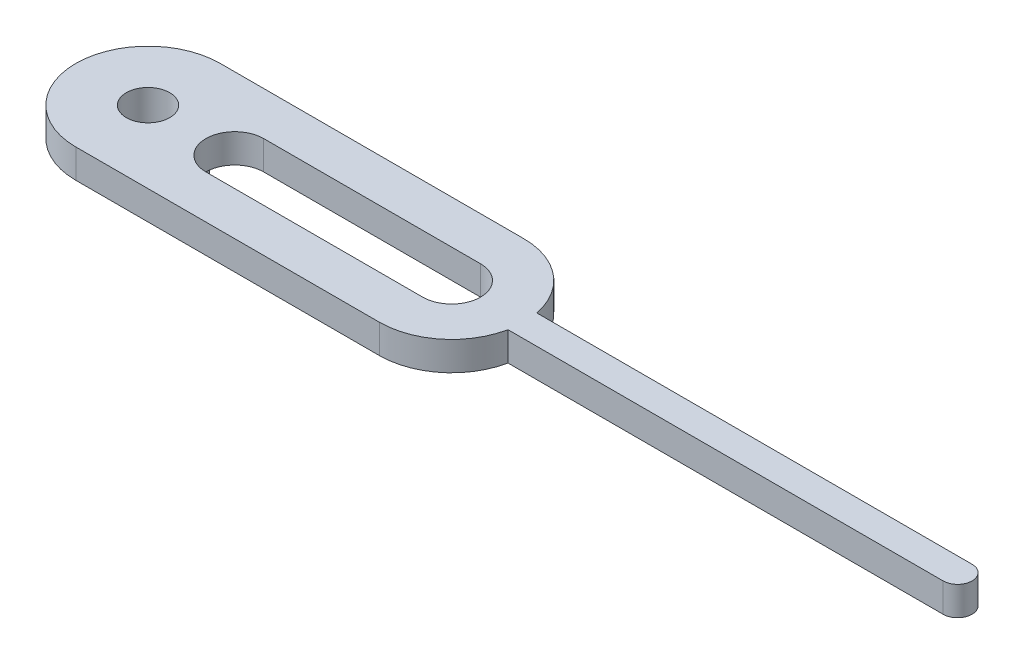
ISO-10303-21;
HEADER;
FILE_DESCRIPTION(('STEP AP214'),'2;1');
FILE_NAME('part.step','',(''),(''),'','','');
FILE_SCHEMA(('AUTOMOTIVE_DESIGN { 1 0 10303 214 1 1 1 1 }'));
ENDSEC;
DATA;
#1=APPLICATION_CONTEXT('core data for automotive mechanical design processes');
#2=APPLICATION_PROTOCOL_DEFINITION('international standard','automotive_design',2000,#1);
#3=PRODUCT_CONTEXT('',#1,'mechanical');
#4=PRODUCT('Part','Part','',(#3));
#5=PRODUCT_RELATED_PRODUCT_CATEGORY('part','',(#4));
#6=PRODUCT_DEFINITION_FORMATION('','',#4);
#7=PRODUCT_DEFINITION_CONTEXT('part definition',#1,'design');
#8=PRODUCT_DEFINITION('design','',#6,#7);
#9=PRODUCT_DEFINITION_SHAPE('','',#8);
#10=(LENGTH_UNIT() NAMED_UNIT(*) SI_UNIT(.MILLI.,.METRE.));
#11=(NAMED_UNIT(*) PLANE_ANGLE_UNIT() SI_UNIT($,.RADIAN.));
#12=(NAMED_UNIT(*) SI_UNIT($,.STERADIAN.) SOLID_ANGLE_UNIT());
#13=UNCERTAINTY_MEASURE_WITH_UNIT(LENGTH_MEASURE(1.E-05),#10,'distance_accuracy_value','');
#14=(GEOMETRIC_REPRESENTATION_CONTEXT(3) GLOBAL_UNCERTAINTY_ASSIGNED_CONTEXT((#13)) GLOBAL_UNIT_ASSIGNED_CONTEXT((#10,
#11,#12)) REPRESENTATION_CONTEXT('',''));
#15=CARTESIAN_POINT('',(0.,0.,0.));
#16=DIRECTION('',(0.,0.,1.));
#17=DIRECTION('',(1.,0.,0.));
#18=AXIS2_PLACEMENT_3D('',#15,#16,#17);
#19=CARTESIAN_POINT('',(0.,0.,0.));
#20=DIRECTION('',(0.,1.,0.));
#21=DIRECTION('',(0.,0.,1.));
#22=AXIS2_PLACEMENT_3D('',#19,#20,#21);
#23=PLANE('',#22);
#24=DIRECTION('',(1.,0.,0.));
#25=VECTOR('',#24,1.);
#26=CARTESIAN_POINT('',(0.,0.,-5.));
#27=LINE('',#26,#25);
#28=CARTESIAN_POINT('',(14.4948974278318,0.,-5.));
#29=VERTEX_POINT('',#28);
#30=CARTESIAN_POINT('',(165.,0.,-5.00000000000004));
#31=VERTEX_POINT('',#30);
#32=EDGE_CURVE('E193',#29,#31,#27,.T.);
#33=ORIENTED_EDGE('',*,*,#32,.T.);
#34=CARTESIAN_POINT('',(165.,0.,0.));
#35=DIRECTION('',(0.,1.,0.));
#36=DIRECTION('',(0.,0.,1.));
#37=AXIS2_PLACEMENT_3D('',#34,#35,#36);
#38=CIRCLE('',#37,5.);
#39=CARTESIAN_POINT('',(165.,0.,4.99999999999997));
#40=VERTEX_POINT('',#39);
#41=EDGE_CURVE('E217',#31,#40,#38,.F.);
#42=ORIENTED_EDGE('',*,*,#41,.T.);
#43=DIRECTION('',(-1.,0.,0.));
#44=VECTOR('',#43,1.);
#45=CARTESIAN_POINT('',(0.,0.,4.99999999999999));
#46=LINE('',#45,#44);
#47=CARTESIAN_POINT('',(14.4948974278318,0.,4.99999999999999));
#48=VERTEX_POINT('',#47);
#49=EDGE_CURVE('E214',#40,#48,#46,.T.);
#50=ORIENTED_EDGE('',*,*,#49,.T.);
#51=CARTESIAN_POINT('',(-10.,0.,0.));
#52=DIRECTION('',(0.,1.,0.));
#53=DIRECTION('',(0.,0.,1.));
#54=AXIS2_PLACEMENT_3D('',#51,#52,#53);
#55=CIRCLE('',#54,25.);
#56=CARTESIAN_POINT('',(-10.,0.,25.));
#57=VERTEX_POINT('',#56);
#58=EDGE_CURVE('E161',#57,#48,#55,.T.);
#59=ORIENTED_EDGE('',*,*,#58,.F.);
#60=DIRECTION('',(1.,0.,0.));
#61=VECTOR('',#60,1.);
#62=CARTESIAN_POINT('',(0.,0.,25.));
#63=LINE('',#62,#61);
#64=CARTESIAN_POINT('',(-115.,0.,25.));
#65=VERTEX_POINT('',#64);
#66=EDGE_CURVE('E208',#65,#57,#63,.T.);
#67=ORIENTED_EDGE('',*,*,#66,.F.);
#68=CARTESIAN_POINT('',(-115.,0.,0.));
#69=DIRECTION('',(0.,1.,0.));
#70=DIRECTION('',(0.,0.,1.));
#71=AXIS2_PLACEMENT_3D('',#68,#69,#70);
#72=CIRCLE('',#71,25.);
#73=CARTESIAN_POINT('',(-115.,0.,-25.));
#74=VERTEX_POINT('',#73);
#75=EDGE_CURVE('E204',#74,#65,#72,.T.);
#76=ORIENTED_EDGE('',*,*,#75,.F.);
#77=DIRECTION('',(-1.,0.,0.));
#78=VECTOR('',#77,1.);
#79=CARTESIAN_POINT('',(0.,0.,-25.));
#80=LINE('',#79,#78);
#81=CARTESIAN_POINT('',(-10.,0.,-25.));
#82=VERTEX_POINT('',#81);
#83=EDGE_CURVE('E200',#82,#74,#80,.T.);
#84=ORIENTED_EDGE('',*,*,#83,.F.);
#85=CARTESIAN_POINT('',(-10.,0.,0.));
#86=DIRECTION('',(0.,1.,0.));
#87=DIRECTION('',(0.,0.,1.));
#88=AXIS2_PLACEMENT_3D('',#85,#86,#87);
#89=CIRCLE('',#88,25.);
#90=EDGE_CURVE('E196',#29,#82,#89,.T.);
#91=ORIENTED_EDGE('',*,*,#90,.F.);
#92=EDGE_LOOP('',(#33,#42,#50,#59,#67,#76,#84,#91));
#93=FACE_BOUND('',#92,.T.);
#94=CARTESIAN_POINT('',(-85.,0.,0.));
#95=DIRECTION('',(0.,1.,0.));
#96=DIRECTION('',(0.,0.,1.));
#97=AXIS2_PLACEMENT_3D('',#94,#95,#96);
#98=CIRCLE('',#97,10.);
#99=CARTESIAN_POINT('',(-85.,0.,-10.));
#100=VERTEX_POINT('',#99);
#101=CARTESIAN_POINT('',(-85.,0.,10.));
#102=VERTEX_POINT('',#101);
#103=EDGE_CURVE('E176',#100,#102,#98,.T.);
#104=ORIENTED_EDGE('',*,*,#103,.T.);
#105=DIRECTION('',(1.,0.,0.));
#106=VECTOR('',#105,1.);
#107=CARTESIAN_POINT('',(0.,0.,10.));
#108=LINE('',#107,#106);
#109=CARTESIAN_POINT('',(-10.,0.,10.));
#110=VERTEX_POINT('',#109);
#111=EDGE_CURVE('E189',#102,#110,#108,.T.);
#112=ORIENTED_EDGE('',*,*,#111,.T.);
#113=CARTESIAN_POINT('',(-10.,0.,0.));
#114=DIRECTION('',(0.,1.,0.));
#115=DIRECTION('',(0.,0.,1.));
#116=AXIS2_PLACEMENT_3D('',#113,#114,#115);
#117=CIRCLE('',#116,10.);
#118=CARTESIAN_POINT('',(-10.,0.,-10.));
#119=VERTEX_POINT('',#118);
#120=EDGE_CURVE('E185',#119,#110,#117,.F.);
#121=ORIENTED_EDGE('',*,*,#120,.F.);
#122=DIRECTION('',(-1.,0.,0.));
#123=VECTOR('',#122,1.);
#124=CARTESIAN_POINT('',(0.,0.,-10.));
#125=LINE('',#124,#123);
#126=EDGE_CURVE('E180',#119,#100,#125,.T.);
#127=ORIENTED_EDGE('',*,*,#126,.T.);
#128=EDGE_LOOP('',(#104,#112,#121,#127));
#129=FACE_BOUND('',#128,.T.);
#130=CARTESIAN_POINT('',(-115.,0.,0.));
#131=DIRECTION('',(0.,1.,0.));
#132=DIRECTION('',(0.,0.,1.));
#133=AXIS2_PLACEMENT_3D('',#130,#131,#132);
#134=CIRCLE('',#133,15.);
#135=CARTESIAN_POINT('',(-115.,0.,15.));
#136=VERTEX_POINT('',#135);
#137=EDGE_CURVE('E11',#136,#136,#134,.F.);
#138=ORIENTED_EDGE('',*,*,#137,.F.);
#139=EDGE_LOOP('',(#138));
#140=FACE_BOUND('',#139,.T.);
#141=ADVANCED_FACE('F47',(#93,#129,#140),#23,.F.);
#142=CARTESIAN_POINT('',(0.,10.,-5.));
#143=DIRECTION('',(0.,0.,-1.));
#144=DIRECTION('',(-1.,0.,0.));
#145=AXIS2_PLACEMENT_3D('',#142,#143,#144);
#146=PLANE('',#145);
#147=ORIENTED_EDGE('',*,*,#32,.F.);
#148=DIRECTION('',(0.,-1.,0.));
#149=VECTOR('',#148,1.);
#150=CARTESIAN_POINT('',(14.4948974278318,10.,-5.));
#151=LINE('',#150,#149);
#152=CARTESIAN_POINT('',(14.4948974278318,10.,-5.));
#153=VERTEX_POINT('',#152);
#154=EDGE_CURVE('E57',#153,#29,#151,.T.);
#155=ORIENTED_EDGE('',*,*,#154,.F.);
#156=DIRECTION('',(1.,0.,0.));
#157=VECTOR('',#156,1.);
#158=CARTESIAN_POINT('',(0.,10.,-5.));
#159=LINE('',#158,#157);
#160=CARTESIAN_POINT('',(165.,10.,-5.00000000000004));
#161=VERTEX_POINT('',#160);
#162=EDGE_CURVE('E281',#153,#161,#159,.T.);
#163=ORIENTED_EDGE('',*,*,#162,.T.);
#164=DIRECTION('',(0.,-1.,0.));
#165=VECTOR('',#164,1.);
#166=CARTESIAN_POINT('',(165.,10.,-5.00000000000004));
#167=LINE('',#166,#165);
#168=EDGE_CURVE('E65',#161,#31,#167,.T.);
#169=ORIENTED_EDGE('',*,*,#168,.T.);
#170=EDGE_LOOP('',(#147,#155,#163,#169));
#171=FACE_BOUND('',#170,.T.);
#172=ADVANCED_FACE('F318',(#171),#146,.T.);
#173=CARTESIAN_POINT('',(-10.,10.,0.));
#174=DIRECTION('',(0.,-1.,0.));
#175=DIRECTION('',(0.,0.,-1.));
#176=AXIS2_PLACEMENT_3D('',#173,#174,#175);
#177=CYLINDRICAL_SURFACE('',#176,25.);
#178=ORIENTED_EDGE('',*,*,#90,.T.);
#179=DIRECTION('',(0.,-1.,0.));
#180=VECTOR('',#179,1.);
#181=CARTESIAN_POINT('',(-10.,10.,-25.));
#182=LINE('',#181,#180);
#183=CARTESIAN_POINT('',(-10.,10.,-25.));
#184=VERTEX_POINT('',#183);
#185=EDGE_CURVE('E236',#184,#82,#182,.T.);
#186=ORIENTED_EDGE('',*,*,#185,.F.);
#187=CARTESIAN_POINT('',(-10.,10.,0.));
#188=DIRECTION('',(0.,1.,0.));
#189=DIRECTION('',(0.,0.,1.));
#190=AXIS2_PLACEMENT_3D('',#187,#188,#189);
#191=CIRCLE('',#190,25.);
#192=EDGE_CURVE('E284',#153,#184,#191,.T.);
#193=ORIENTED_EDGE('',*,*,#192,.F.);
#194=ORIENTED_EDGE('',*,*,#154,.T.);
#195=EDGE_LOOP('',(#178,#186,#193,#194));
#196=FACE_BOUND('',#195,.T.);
#197=ADVANCED_FACE('F322',(#196),#177,.T.);
#198=CARTESIAN_POINT('',(0.,10.,-25.));
#199=DIRECTION('',(0.,0.,1.));
#200=DIRECTION('',(1.,0.,0.));
#201=AXIS2_PLACEMENT_3D('',#198,#199,#200);
#202=PLANE('',#201);
#203=ORIENTED_EDGE('',*,*,#83,.T.);
#204=DIRECTION('',(0.,-1.,0.));
#205=VECTOR('',#204,1.);
#206=CARTESIAN_POINT('',(-115.,10.,-25.));
#207=LINE('',#206,#205);
#208=CARTESIAN_POINT('',(-115.,10.,-25.));
#209=VERTEX_POINT('',#208);
#210=EDGE_CURVE('E232',#209,#74,#207,.T.);
#211=ORIENTED_EDGE('',*,*,#210,.F.);
#212=DIRECTION('',(-1.,0.,0.));
#213=VECTOR('',#212,1.);
#214=CARTESIAN_POINT('',(0.,10.,-25.));
#215=LINE('',#214,#213);
#216=EDGE_CURVE('E288',#184,#209,#215,.T.);
#217=ORIENTED_EDGE('',*,*,#216,.F.);
#218=ORIENTED_EDGE('',*,*,#185,.T.);
#219=EDGE_LOOP('',(#203,#211,#217,#218));
#220=FACE_BOUND('',#219,.T.);
#221=ADVANCED_FACE('F458',(#220),#202,.F.);
#222=CARTESIAN_POINT('',(-115.,10.,0.));
#223=DIRECTION('',(0.,-1.,0.));
#224=DIRECTION('',(0.,0.,-1.));
#225=AXIS2_PLACEMENT_3D('',#222,#223,#224);
#226=CYLINDRICAL_SURFACE('',#225,25.);
#227=ORIENTED_EDGE('',*,*,#75,.T.);
#228=DIRECTION('',(0.,-1.,0.));
#229=VECTOR('',#228,1.);
#230=CARTESIAN_POINT('',(-115.,10.,25.));
#231=LINE('',#230,#229);
#232=CARTESIAN_POINT('',(-115.,10.,25.));
#233=VERTEX_POINT('',#232);
#234=EDGE_CURVE('E228',#233,#65,#231,.T.);
#235=ORIENTED_EDGE('',*,*,#234,.F.);
#236=CARTESIAN_POINT('',(-115.,10.,0.));
#237=DIRECTION('',(0.,1.,0.));
#238=DIRECTION('',(0.,0.,1.));
#239=AXIS2_PLACEMENT_3D('',#236,#237,#238);
#240=CIRCLE('',#239,25.);
#241=EDGE_CURVE('E292',#209,#233,#240,.T.);
#242=ORIENTED_EDGE('',*,*,#241,.F.);
#243=ORIENTED_EDGE('',*,*,#210,.T.);
#244=EDGE_LOOP('',(#227,#235,#242,#243));
#245=FACE_BOUND('',#244,.T.);
#246=ADVANCED_FACE('F298',(#245),#226,.T.);
#247=CARTESIAN_POINT('',(0.,10.,25.));
#248=DIRECTION('',(0.,0.,-1.));
#249=DIRECTION('',(-1.,0.,0.));
#250=AXIS2_PLACEMENT_3D('',#247,#248,#249);
#251=PLANE('',#250);
#252=ORIENTED_EDGE('',*,*,#66,.T.);
#253=DIRECTION('',(0.,-1.,0.));
#254=VECTOR('',#253,1.);
#255=CARTESIAN_POINT('',(-10.,10.,25.));
#256=LINE('',#255,#254);
#257=CARTESIAN_POINT('',(-10.,10.,25.));
#258=VERTEX_POINT('',#257);
#259=EDGE_CURVE('E165',#258,#57,#256,.T.);
#260=ORIENTED_EDGE('',*,*,#259,.F.);
#261=DIRECTION('',(1.,0.,0.));
#262=VECTOR('',#261,1.);
#263=CARTESIAN_POINT('',(0.,10.,25.));
#264=LINE('',#263,#262);
#265=EDGE_CURVE('E152',#233,#258,#264,.T.);
#266=ORIENTED_EDGE('',*,*,#265,.F.);
#267=ORIENTED_EDGE('',*,*,#234,.T.);
#268=EDGE_LOOP('',(#252,#260,#266,#267));
#269=FACE_BOUND('',#268,.T.);
#270=ADVANCED_FACE('F300',(#269),#251,.F.);
#271=CARTESIAN_POINT('',(-10.,10.,0.));
#272=DIRECTION('',(0.,-1.,0.));
#273=DIRECTION('',(0.,0.,-1.));
#274=AXIS2_PLACEMENT_3D('',#271,#272,#273);
#275=CYLINDRICAL_SURFACE('',#274,25.);
#276=ORIENTED_EDGE('',*,*,#58,.T.);
#277=DIRECTION('',(0.,-1.,0.));
#278=VECTOR('',#277,1.);
#279=CARTESIAN_POINT('',(14.4948974278318,10.,4.99999999999999));
#280=LINE('',#279,#278);
#281=CARTESIAN_POINT('',(14.4948974278318,10.,4.99999999999999));
#282=VERTEX_POINT('',#281);
#283=EDGE_CURVE('E159',#282,#48,#280,.T.);
#284=ORIENTED_EDGE('',*,*,#283,.F.);
#285=CARTESIAN_POINT('',(-10.,10.,0.));
#286=DIRECTION('',(0.,1.,0.));
#287=DIRECTION('',(0.,0.,1.));
#288=AXIS2_PLACEMENT_3D('',#285,#286,#287);
#289=CIRCLE('',#288,25.);
#290=EDGE_CURVE('E144',#258,#282,#289,.T.);
#291=ORIENTED_EDGE('',*,*,#290,.F.);
#292=ORIENTED_EDGE('',*,*,#259,.T.);
#293=EDGE_LOOP('',(#276,#284,#291,#292));
#294=FACE_BOUND('',#293,.T.);
#295=ADVANCED_FACE('F160',(#294),#275,.T.);
#296=CARTESIAN_POINT('',(0.,10.,4.99999999999999));
#297=DIRECTION('',(0.,0.,1.));
#298=DIRECTION('',(1.,0.,0.));
#299=AXIS2_PLACEMENT_3D('',#296,#297,#298);
#300=PLANE('',#299);
#301=ORIENTED_EDGE('',*,*,#49,.F.);
#302=DIRECTION('',(0.,-1.,0.));
#303=VECTOR('',#302,1.);
#304=CARTESIAN_POINT('',(165.,10.,4.99999999999997));
#305=LINE('',#304,#303);
#306=CARTESIAN_POINT('',(165.,10.,4.99999999999997));
#307=VERTEX_POINT('',#306);
#308=EDGE_CURVE('E103',#307,#40,#305,.T.);
#309=ORIENTED_EDGE('',*,*,#308,.F.);
#310=DIRECTION('',(-1.,0.,0.));
#311=VECTOR('',#310,1.);
#312=CARTESIAN_POINT('',(0.,10.,4.99999999999999));
#313=LINE('',#312,#311);
#314=EDGE_CURVE('E150',#307,#282,#313,.T.);
#315=ORIENTED_EDGE('',*,*,#314,.T.);
#316=ORIENTED_EDGE('',*,*,#283,.T.);
#317=EDGE_LOOP('',(#301,#309,#315,#316));
#318=FACE_BOUND('',#317,.T.);
#319=ADVANCED_FACE('F167',(#318),#300,.T.);
#320=CARTESIAN_POINT('',(-85.,10.,0.));
#321=DIRECTION('',(0.,-1.,0.));
#322=DIRECTION('',(0.,0.,-1.));
#323=AXIS2_PLACEMENT_3D('',#320,#321,#322);
#324=CYLINDRICAL_SURFACE('',#323,10.);
#325=ORIENTED_EDGE('',*,*,#103,.F.);
#326=DIRECTION('',(0.,-1.,0.));
#327=VECTOR('',#326,1.);
#328=CARTESIAN_POINT('',(-85.,10.,-10.));
#329=LINE('',#328,#327);
#330=CARTESIAN_POINT('',(-85.,10.,-10.));
#331=VERTEX_POINT('',#330);
#332=EDGE_CURVE('E115',#331,#100,#329,.T.);
#333=ORIENTED_EDGE('',*,*,#332,.F.);
#334=CARTESIAN_POINT('',(-85.,10.,0.));
#335=DIRECTION('',(0.,1.,0.));
#336=DIRECTION('',(0.,0.,1.));
#337=AXIS2_PLACEMENT_3D('',#334,#335,#336);
#338=CIRCLE('',#337,10.);
#339=CARTESIAN_POINT('',(-85.,10.,10.));
#340=VERTEX_POINT('',#339);
#341=EDGE_CURVE('E272',#331,#340,#338,.T.);
#342=ORIENTED_EDGE('',*,*,#341,.T.);
#343=DIRECTION('',(0.,-1.,0.));
#344=VECTOR('',#343,1.);
#345=CARTESIAN_POINT('',(-85.,10.,10.));
#346=LINE('',#345,#344);
#347=EDGE_CURVE('E172',#340,#102,#346,.T.);
#348=ORIENTED_EDGE('',*,*,#347,.T.);
#349=EDGE_LOOP('',(#325,#333,#342,#348));
#350=FACE_BOUND('',#349,.T.);
#351=ADVANCED_FACE('F256',(#350),#324,.F.);
#352=CARTESIAN_POINT('',(0.,10.,-10.));
#353=DIRECTION('',(0.,0.,1.));
#354=DIRECTION('',(1.,0.,0.));
#355=AXIS2_PLACEMENT_3D('',#352,#353,#354);
#356=PLANE('',#355);
#357=ORIENTED_EDGE('',*,*,#126,.F.);
#358=DIRECTION('',(0.,-1.,0.));
#359=VECTOR('',#358,1.);
#360=CARTESIAN_POINT('',(-10.,10.,-10.));
#361=LINE('',#360,#359);
#362=CARTESIAN_POINT('',(-10.,10.,-10.));
#363=VERTEX_POINT('',#362);
#364=EDGE_CURVE('E247',#363,#119,#361,.T.);
#365=ORIENTED_EDGE('',*,*,#364,.F.);
#366=DIRECTION('',(-1.,0.,0.));
#367=VECTOR('',#366,1.);
#368=CARTESIAN_POINT('',(0.,10.,-10.));
#369=LINE('',#368,#367);
#370=EDGE_CURVE('E255',#363,#331,#369,.T.);
#371=ORIENTED_EDGE('',*,*,#370,.T.);
#372=ORIENTED_EDGE('',*,*,#332,.T.);
#373=EDGE_LOOP('',(#357,#365,#371,#372));
#374=FACE_BOUND('',#373,.T.);
#375=ADVANCED_FACE('F253',(#374),#356,.T.);
#376=CARTESIAN_POINT('',(-10.,10.,0.));
#377=DIRECTION('',(0.,-1.,0.));
#378=DIRECTION('',(0.,0.,-1.));
#379=AXIS2_PLACEMENT_3D('',#376,#377,#378);
#380=CYLINDRICAL_SURFACE('',#379,10.);
#381=ORIENTED_EDGE('',*,*,#120,.T.);
#382=DIRECTION('',(0.,-1.,0.));
#383=VECTOR('',#382,1.);
#384=CARTESIAN_POINT('',(-10.,10.,10.));
#385=LINE('',#384,#383);
#386=CARTESIAN_POINT('',(-10.,10.,10.));
#387=VERTEX_POINT('',#386);
#388=EDGE_CURVE('E244',#387,#110,#385,.T.);
#389=ORIENTED_EDGE('',*,*,#388,.F.);
#390=CARTESIAN_POINT('',(-10.,10.,0.));
#391=DIRECTION('',(0.,1.,0.));
#392=DIRECTION('',(0.,0.,1.));
#393=AXIS2_PLACEMENT_3D('',#390,#391,#392);
#394=CIRCLE('',#393,10.);
#395=EDGE_CURVE('E266',#363,#387,#394,.F.);
#396=ORIENTED_EDGE('',*,*,#395,.F.);
#397=ORIENTED_EDGE('',*,*,#364,.T.);
#398=EDGE_LOOP('',(#381,#389,#396,#397));
#399=FACE_BOUND('',#398,.T.);
#400=ADVANCED_FACE('F263',(#399),#380,.F.);
#401=CARTESIAN_POINT('',(0.,10.,10.));
#402=DIRECTION('',(0.,0.,-1.));
#403=DIRECTION('',(-1.,0.,0.));
#404=AXIS2_PLACEMENT_3D('',#401,#402,#403);
#405=PLANE('',#404);
#406=ORIENTED_EDGE('',*,*,#111,.F.);
#407=ORIENTED_EDGE('',*,*,#347,.F.);
#408=DIRECTION('',(1.,0.,0.));
#409=VECTOR('',#408,1.);
#410=CARTESIAN_POINT('',(0.,10.,10.));
#411=LINE('',#410,#409);
#412=EDGE_CURVE('E270',#340,#387,#411,.T.);
#413=ORIENTED_EDGE('',*,*,#412,.T.);
#414=ORIENTED_EDGE('',*,*,#388,.T.);
#415=EDGE_LOOP('',(#406,#407,#413,#414));
#416=FACE_BOUND('',#415,.T.);
#417=ADVANCED_FACE('F313',(#416),#405,.T.);
#418=CARTESIAN_POINT('',(-115.,10.,0.));
#419=DIRECTION('',(0.,-1.,0.));
#420=DIRECTION('',(0.,0.,-1.));
#421=AXIS2_PLACEMENT_3D('',#418,#419,#420);
#422=CYLINDRICAL_SURFACE('',#421,7.5);
#423=CARTESIAN_POINT('',(-115.,10.,0.));
#424=DIRECTION('',(0.,1.,0.));
#425=DIRECTION('',(0.,0.,1.));
#426=AXIS2_PLACEMENT_3D('',#423,#424,#425);
#427=CIRCLE('',#426,7.5);
#428=CARTESIAN_POINT('',(-115.,10.,7.5));
#429=VERTEX_POINT('',#428);
#430=EDGE_CURVE('E221',#429,#429,#427,.T.);
#431=ORIENTED_EDGE('',*,*,#430,.T.);
#432=EDGE_LOOP('',(#431));
#433=FACE_BOUND('',#432,.T.);
#434=CARTESIAN_POINT('',(-115.,-10.,0.));
#435=DIRECTION('',(0.,-1.,0.));
#436=DIRECTION('',(0.,0.,-1.));
#437=AXIS2_PLACEMENT_3D('',#434,#435,#436);
#438=CIRCLE('',#437,7.5);
#439=CARTESIAN_POINT('',(-115.,-10.,-7.5));
#440=VERTEX_POINT('',#439);
#441=EDGE_CURVE('E338',#440,#440,#438,.T.);
#442=ORIENTED_EDGE('',*,*,#441,.T.);
#443=EDGE_LOOP('',(#442));
#444=FACE_BOUND('',#443,.T.);
#445=ADVANCED_FACE('F49',(#433,#444),#422,.F.);
#446=CARTESIAN_POINT('',(165.,10.,0.));
#447=DIRECTION('',(0.,-1.,0.));
#448=DIRECTION('',(0.,0.,-1.));
#449=AXIS2_PLACEMENT_3D('',#446,#447,#448);
#450=CYLINDRICAL_SURFACE('',#449,5.);
#451=ORIENTED_EDGE('',*,*,#41,.F.);
#452=ORIENTED_EDGE('',*,*,#168,.F.);
#453=CARTESIAN_POINT('',(165.,10.,0.));
#454=DIRECTION('',(0.,1.,0.));
#455=DIRECTION('',(0.,0.,1.));
#456=AXIS2_PLACEMENT_3D('',#453,#454,#455);
#457=CIRCLE('',#456,5.);
#458=EDGE_CURVE('E169',#161,#307,#457,.F.);
#459=ORIENTED_EDGE('',*,*,#458,.T.);
#460=ORIENTED_EDGE('',*,*,#308,.T.);
#461=EDGE_LOOP('',(#451,#452,#459,#460));
#462=FACE_BOUND('',#461,.T.);
#463=ADVANCED_FACE('F303',(#462),#450,.T.);
#464=CARTESIAN_POINT('',(0.,10.,0.));
#465=DIRECTION('',(0.,1.,0.));
#466=DIRECTION('',(0.,0.,1.));
#467=AXIS2_PLACEMENT_3D('',#464,#465,#466);
#468=PLANE('',#467);
#469=ORIENTED_EDGE('',*,*,#430,.F.);
#470=EDGE_LOOP('',(#469));
#471=FACE_BOUND('',#470,.T.);
#472=ORIENTED_EDGE('',*,*,#341,.F.);
#473=ORIENTED_EDGE('',*,*,#370,.F.);
#474=ORIENTED_EDGE('',*,*,#395,.T.);
#475=ORIENTED_EDGE('',*,*,#412,.F.);
#476=EDGE_LOOP('',(#472,#473,#474,#475));
#477=FACE_BOUND('',#476,.T.);
#478=ORIENTED_EDGE('',*,*,#162,.F.);
#479=ORIENTED_EDGE('',*,*,#192,.T.);
#480=ORIENTED_EDGE('',*,*,#216,.T.);
#481=ORIENTED_EDGE('',*,*,#241,.T.);
#482=ORIENTED_EDGE('',*,*,#265,.T.);
#483=ORIENTED_EDGE('',*,*,#290,.T.);
#484=ORIENTED_EDGE('',*,*,#314,.F.);
#485=ORIENTED_EDGE('',*,*,#458,.F.);
#486=EDGE_LOOP('',(#478,#479,#480,#481,#482,#483,#484,#485));
#487=FACE_BOUND('',#486,.T.);
#488=ADVANCED_FACE('F147',(#471,#477,#487),#468,.T.);
#489=CARTESIAN_POINT('',(-115.,-10.,0.));
#490=DIRECTION('',(0.,-1.,0.));
#491=DIRECTION('',(0.,0.,-1.));
#492=AXIS2_PLACEMENT_3D('',#489,#490,#491);
#493=PLANE('',#492);
#494=CARTESIAN_POINT('',(-115.,-10.,0.));
#495=DIRECTION('',(0.,-1.,0.));
#496=DIRECTION('',(0.,0.,-1.));
#497=AXIS2_PLACEMENT_3D('',#494,#495,#496);
#498=CIRCLE('',#497,15.);
#499=CARTESIAN_POINT('',(-115.,-10.,-15.));
#500=VERTEX_POINT('',#499);
#501=EDGE_CURVE('E181',#500,#500,#498,.T.);
#502=ORIENTED_EDGE('',*,*,#501,.T.);
#503=EDGE_LOOP('',(#502));
#504=FACE_BOUND('',#503,.T.);
#505=ORIENTED_EDGE('',*,*,#441,.F.);
#506=EDGE_LOOP('',(#505));
#507=FACE_BOUND('',#506,.T.);
#508=ADVANCED_FACE('F310',(#504,#507),#493,.T.);
#509=CARTESIAN_POINT('',(-115.,-10.,0.));
#510=DIRECTION('',(0.,1.,0.));
#511=DIRECTION('',(0.,0.,1.));
#512=AXIS2_PLACEMENT_3D('',#509,#510,#511);
#513=CYLINDRICAL_SURFACE('',#512,15.);
#514=ORIENTED_EDGE('',*,*,#501,.F.);
#515=EDGE_LOOP('',(#514));
#516=FACE_BOUND('',#515,.T.);
#517=ORIENTED_EDGE('',*,*,#137,.T.);
#518=EDGE_LOOP('',(#517));
#519=FACE_BOUND('',#518,.T.);
#520=ADVANCED_FACE('F325',(#516,#519),#513,.T.);
#521=CLOSED_SHELL('',(#141,#172,#197,#221,#246,#270,#295,#319,#351,#375,#400,#417,#445,#463,
#488,#508,#520));
#522=MANIFOLD_SOLID_BREP('B2',#521);
#523=ADVANCED_BREP_SHAPE_REPRESENTATION('',(#18,#522),#14);
#524=SHAPE_DEFINITION_REPRESENTATION(#9,#523);
ENDSEC;
END-ISO-10303-21;
